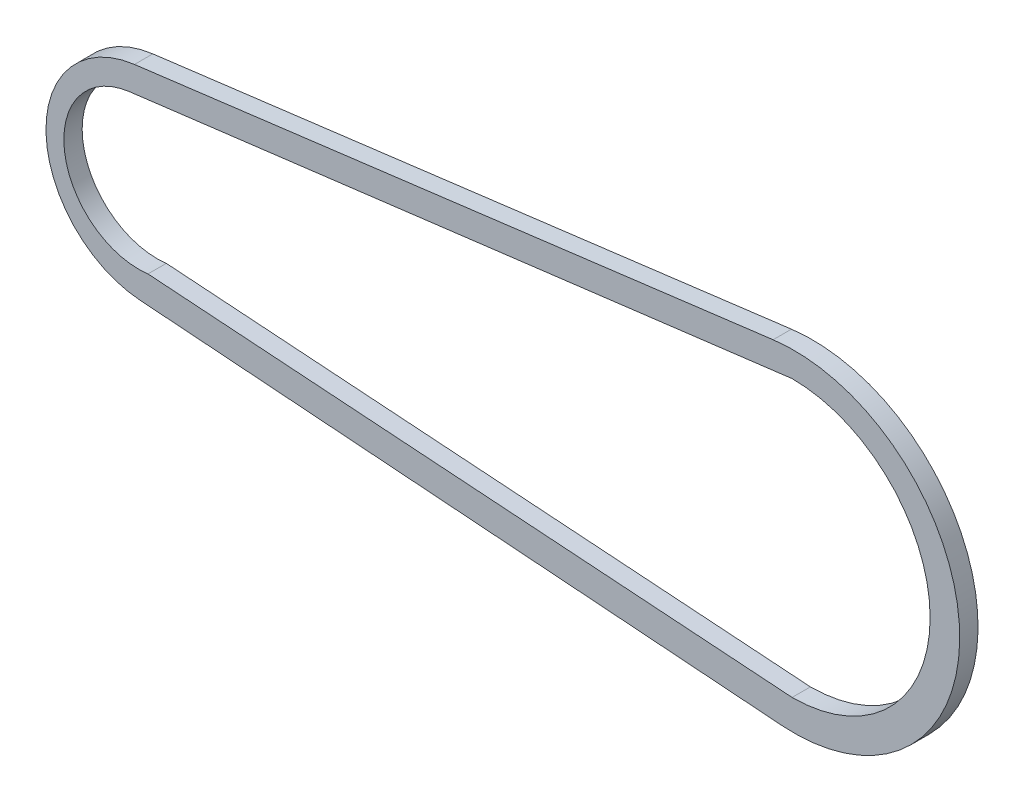
ISO-10303-21;
HEADER;
FILE_DESCRIPTION(('STEP AP214'),'2;1');
FILE_NAME('part.step','',(''),(''),'','','');
FILE_SCHEMA(('AUTOMOTIVE_DESIGN { 1 0 10303 214 1 1 1 1 }'));
ENDSEC;
DATA;
#1=APPLICATION_CONTEXT('core data for automotive mechanical design processes');
#2=APPLICATION_PROTOCOL_DEFINITION('international standard','automotive_design',2000,#1);
#3=PRODUCT_CONTEXT('',#1,'mechanical');
#4=PRODUCT('Part','Part','',(#3));
#5=PRODUCT_RELATED_PRODUCT_CATEGORY('part','',(#4));
#6=PRODUCT_DEFINITION_FORMATION('','',#4);
#7=PRODUCT_DEFINITION_CONTEXT('part definition',#1,'design');
#8=PRODUCT_DEFINITION('design','',#6,#7);
#9=PRODUCT_DEFINITION_SHAPE('','',#8);
#10=(LENGTH_UNIT() NAMED_UNIT(*) SI_UNIT(.MILLI.,.METRE.));
#11=(NAMED_UNIT(*) PLANE_ANGLE_UNIT() SI_UNIT($,.RADIAN.));
#12=(NAMED_UNIT(*) SI_UNIT($,.STERADIAN.) SOLID_ANGLE_UNIT());
#13=UNCERTAINTY_MEASURE_WITH_UNIT(LENGTH_MEASURE(1.E-05),#10,'distance_accuracy_value','');
#14=(GEOMETRIC_REPRESENTATION_CONTEXT(3) GLOBAL_UNCERTAINTY_ASSIGNED_CONTEXT((#13)) GLOBAL_UNIT_ASSIGNED_CONTEXT((#10,
#11,#12)) REPRESENTATION_CONTEXT('',''));
#15=CARTESIAN_POINT('',(0.,0.,0.));
#16=DIRECTION('',(0.,0.,1.));
#17=DIRECTION('',(1.,0.,0.));
#18=AXIS2_PLACEMENT_3D('',#15,#16,#17);
#19=CARTESIAN_POINT('',(334.170150376708,26.7589443408219,0.));
#20=DIRECTION('',(0.,0.,-1.));
#21=DIRECTION('',(-1.,0.,0.));
#22=AXIS2_PLACEMENT_3D('',#19,#20,#21);
#23=CYLINDRICAL_SURFACE('',#22,90.4461105360026);
#24=DIRECTION('',(0.,0.,-1.));
#25=VECTOR('',#24,1.);
#26=CARTESIAN_POINT('',(327.508384316098,-63.4414979199814,10.));
#27=LINE('',#26,#25);
#28=CARTESIAN_POINT('',(327.508384316098,-63.4414979199814,0.));
#29=VERTEX_POINT('',#28);
#30=CARTESIAN_POINT('',(327.508384316098,-63.4414979199814,10.));
#31=VERTEX_POINT('',#30);
#32=EDGE_CURVE('E164',#29,#31,#27,.F.);
#33=ORIENTED_EDGE('',*,*,#32,.F.);
#34=CARTESIAN_POINT('',(334.170150376708,26.7589443408219,0.));
#35=DIRECTION('',(0.,0.,-1.));
#36=DIRECTION('',(-1.,0.,0.));
#37=AXIS2_PLACEMENT_3D('',#34,#35,#36);
#38=CIRCLE('',#37,90.4461105360026);
#39=CARTESIAN_POINT('',(322.802434907123,116.487835764339,0.));
#40=VERTEX_POINT('',#39);
#41=EDGE_CURVE('E51',#40,#29,#38,.T.);
#42=ORIENTED_EDGE('',*,*,#41,.F.);
#43=DIRECTION('',(0.,0.,-1.));
#44=VECTOR('',#43,1.);
#45=CARTESIAN_POINT('',(322.802434907122,116.487835764339,10.));
#46=LINE('',#45,#44);
#47=CARTESIAN_POINT('',(322.802434907123,116.487835764339,10.));
#48=VERTEX_POINT('',#47);
#49=EDGE_CURVE('E167',#48,#40,#46,.T.);
#50=ORIENTED_EDGE('',*,*,#49,.F.);
#51=CARTESIAN_POINT('',(334.170150376708,26.7589443408219,10.));
#52=DIRECTION('',(0.,0.,-1.));
#53=DIRECTION('',(-1.,0.,0.));
#54=AXIS2_PLACEMENT_3D('',#51,#52,#53);
#55=CIRCLE('',#54,90.4461105360026);
#56=EDGE_CURVE('E12',#31,#48,#55,.F.);
#57=ORIENTED_EDGE('',*,*,#56,.F.);
#58=EDGE_LOOP('',(#33,#42,#50,#57));
#59=FACE_BOUND('',#58,.T.);
#60=ADVANCED_FACE('F43',(#59),#23,.T.);
#61=CARTESIAN_POINT('',(-18.7822793276164,17.5276742418741,0.));
#62=DIRECTION('',(0.,0.,-1.));
#63=DIRECTION('',(-1.,0.,0.));
#64=AXIS2_PLACEMENT_3D('',#61,#62,#63);
#65=CYLINDRICAL_SURFACE('',#64,55.2433677768149);
#66=DIRECTION('',(0.,0.,-1.));
#67=VECTOR('',#66,1.);
#68=CARTESIAN_POINT('',(-25.7255396043369,72.3329734387049,10.));
#69=LINE('',#68,#67);
#70=CARTESIAN_POINT('',(-25.7255396043369,72.3329734387049,0.));
#71=VERTEX_POINT('',#70);
#72=CARTESIAN_POINT('',(-25.7255396043369,72.3329734387049,10.));
#73=VERTEX_POINT('',#72);
#74=EDGE_CURVE('E150',#71,#73,#69,.F.);
#75=ORIENTED_EDGE('',*,*,#74,.F.);
#76=CARTESIAN_POINT('',(-18.7822793276164,17.5276742418741,0.));
#77=DIRECTION('',(0.,0.,-1.));
#78=DIRECTION('',(-1.,0.,0.));
#79=AXIS2_PLACEMENT_3D('',#76,#77,#78);
#80=CIRCLE('',#79,55.2433677768149);
#81=CARTESIAN_POINT('',(-22.851203799309,-37.5656423851733,0.));
#82=VERTEX_POINT('',#81);
#83=EDGE_CURVE('E159',#82,#71,#80,.T.);
#84=ORIENTED_EDGE('',*,*,#83,.F.);
#85=DIRECTION('',(0.,0.,-1.));
#86=VECTOR('',#85,1.);
#87=CARTESIAN_POINT('',(-22.851203799309,-37.5656423851733,10.));
#88=LINE('',#87,#86);
#89=CARTESIAN_POINT('',(-22.851203799309,-37.5656423851733,10.));
#90=VERTEX_POINT('',#89);
#91=EDGE_CURVE('E156',#90,#82,#88,.T.);
#92=ORIENTED_EDGE('',*,*,#91,.F.);
#93=CARTESIAN_POINT('',(-18.7822793276164,17.5276742418741,10.));
#94=DIRECTION('',(0.,0.,-1.));
#95=DIRECTION('',(-1.,0.,0.));
#96=AXIS2_PLACEMENT_3D('',#93,#94,#95);
#97=CIRCLE('',#96,55.2433677768149);
#98=EDGE_CURVE('E162',#73,#90,#97,.F.);
#99=ORIENTED_EDGE('',*,*,#98,.F.);
#100=EDGE_LOOP('',(#75,#84,#92,#99));
#101=FACE_BOUND('',#100,.T.);
#102=ADVANCED_FACE('F181',(#101),#65,.T.);
#103=CARTESIAN_POINT('',(-74.0256471044313,66.213853158706,10.));
#104=DIRECTION('',(0.125684956514083,-0.992070205028885,0.));
#105=DIRECTION('',(0.992070205028885,0.125684956514083,0.));
#106=AXIS2_PLACEMENT_3D('',#103,#104,#105);
#107=PLANE('',#106);
#108=DIRECTION('',(-0.992070205028885,-0.125684956514083,0.));
#109=VECTOR('',#108,1.);
#110=CARTESIAN_POINT('',(-74.0256471044313,66.213853158706,10.));
#111=LINE('',#110,#109);
#112=EDGE_CURVE('E144',#48,#73,#111,.T.);
#113=ORIENTED_EDGE('',*,*,#112,.F.);
#114=ORIENTED_EDGE('',*,*,#49,.T.);
#115=DIRECTION('',(-0.992070205028885,-0.125684956514083,0.));
#116=VECTOR('',#115,1.);
#117=CARTESIAN_POINT('',(-74.0256471044313,66.213853158706,0.));
#118=LINE('',#117,#116);
#119=EDGE_CURVE('E140',#40,#71,#118,.T.);
#120=ORIENTED_EDGE('',*,*,#119,.T.);
#121=ORIENTED_EDGE('',*,*,#74,.T.);
#122=EDGE_LOOP('',(#113,#114,#120,#121));
#123=FACE_BOUND('',#122,.T.);
#124=ADVANCED_FACE('F184',(#123),#107,.F.);
#125=CARTESIAN_POINT('',(424.616260912711,-70.613413492842,10.));
#126=DIRECTION('',(0.073654533303096,0.997283816034284,0.));
#127=DIRECTION('',(-0.997283816034284,0.073654533303096,0.));
#128=AXIS2_PLACEMENT_3D('',#125,#126,#127);
#129=PLANE('',#128);
#130=DIRECTION('',(0.997283816034284,-0.073654533303096,0.));
#131=VECTOR('',#130,1.);
#132=CARTESIAN_POINT('',(424.616260912711,-70.613413492842,0.));
#133=LINE('',#132,#131);
#134=EDGE_CURVE('E147',#82,#29,#133,.T.);
#135=ORIENTED_EDGE('',*,*,#134,.T.);
#136=ORIENTED_EDGE('',*,*,#32,.T.);
#137=DIRECTION('',(0.997283816034284,-0.073654533303096,0.));
#138=VECTOR('',#137,1.);
#139=CARTESIAN_POINT('',(424.616260912711,-70.613413492842,10.));
#140=LINE('',#139,#138);
#141=EDGE_CURVE('E146',#90,#31,#140,.T.);
#142=ORIENTED_EDGE('',*,*,#141,.F.);
#143=ORIENTED_EDGE('',*,*,#91,.T.);
#144=EDGE_LOOP('',(#135,#136,#142,#143));
#145=FACE_BOUND('',#144,.T.);
#146=ADVANCED_FACE('F176',(#145),#129,.F.);
#147=CARTESIAN_POINT('',(0.,0.,10.));
#148=DIRECTION('',(0.,0.,-1.));
#149=DIRECTION('',(-1.,0.,0.));
#150=AXIS2_PLACEMENT_3D('',#147,#148,#149);
#151=PLANE('',#150);
#152=DIRECTION('',(0.997597962243883,-0.0692698038603488,0.));
#153=VECTOR('',#152,1.);
#154=CARTESIAN_POINT('',(-18.3537439433149,-22.9837509239603,10.));
#155=LINE('',#154,#153);
#156=CARTESIAN_POINT('',(-18.3537439433149,-22.9837509239603,10.));
#157=VERTEX_POINT('',#156);
#158=CARTESIAN_POINT('',(333.136967432265,-47.3900684558807,10.));
#159=VERTEX_POINT('',#158);
#160=EDGE_CURVE('E134',#157,#159,#155,.T.);
#161=ORIENTED_EDGE('',*,*,#160,.F.);
#162=CARTESIAN_POINT('',(-23.4204557240256,17.5499433217256,10.));
#163=DIRECTION('',(0.,0.,1.));
#164=DIRECTION('',(1.,0.,0.));
#165=AXIS2_PLACEMENT_3D('',#162,#163,#164);
#166=CIRCLE('',#165,40.8491363124307);
#167=CARTESIAN_POINT('',(-28.4871675047363,58.0836375674115,10.));
#168=VERTEX_POINT('',#167);
#169=EDGE_CURVE('E58',#168,#157,#166,.T.);
#170=ORIENTED_EDGE('',*,*,#169,.F.);
#171=DIRECTION('',(-0.992277876713668,-0.124034734589209,0.));
#172=VECTOR('',#171,1.);
#173=CARTESIAN_POINT('',(-28.4871675047363,58.0836375674115,10.));
#174=LINE('',#173,#172);
#175=CARTESIAN_POINT('',(333.136967432265,103.286654434537,10.));
#176=VERTEX_POINT('',#175);
#177=EDGE_CURVE('E125',#176,#168,#174,.T.);
#178=ORIENTED_EDGE('',*,*,#177,.F.);
#179=CARTESIAN_POINT('',(333.136967432265,27.948292989328,10.));
#180=DIRECTION('',(0.,0.,1.));
#181=DIRECTION('',(-1.,0.,0.));
#182=AXIS2_PLACEMENT_3D('',#179,#180,#181);
#183=CIRCLE('',#182,75.3383614452087);
#184=EDGE_CURVE('E128',#159,#176,#183,.T.);
#185=ORIENTED_EDGE('',*,*,#184,.F.);
#186=EDGE_LOOP('',(#161,#170,#178,#185));
#187=FACE_BOUND('',#186,.T.);
#188=ORIENTED_EDGE('',*,*,#141,.T.);
#189=ORIENTED_EDGE('',*,*,#56,.T.);
#190=ORIENTED_EDGE('',*,*,#112,.T.);
#191=ORIENTED_EDGE('',*,*,#98,.T.);
#192=EDGE_LOOP('',(#188,#189,#190,#191));
#193=FACE_BOUND('',#192,.T.);
#194=ADVANCED_FACE('F186',(#187,#193),#151,.F.);
#195=CARTESIAN_POINT('',(0.,0.,0.));
#196=DIRECTION('',(0.,0.,-1.));
#197=DIRECTION('',(-1.,0.,0.));
#198=AXIS2_PLACEMENT_3D('',#195,#196,#197);
#199=PLANE('',#198);
#200=CARTESIAN_POINT('',(-23.4204557240256,17.5499433217256,0.));
#201=DIRECTION('',(0.,0.,1.));
#202=DIRECTION('',(1.,0.,0.));
#203=AXIS2_PLACEMENT_3D('',#200,#201,#202);
#204=CIRCLE('',#203,40.8491363124307);
#205=CARTESIAN_POINT('',(-28.4871675047363,58.0836375674115,0.));
#206=VERTEX_POINT('',#205);
#207=CARTESIAN_POINT('',(-18.3537439433149,-22.9837509239603,0.));
#208=VERTEX_POINT('',#207);
#209=EDGE_CURVE('E109',#206,#208,#204,.T.);
#210=ORIENTED_EDGE('',*,*,#209,.T.);
#211=DIRECTION('',(0.997597962243883,-0.0692698038603488,0.));
#212=VECTOR('',#211,1.);
#213=CARTESIAN_POINT('',(-18.3537439433149,-22.9837509239603,0.));
#214=LINE('',#213,#212);
#215=CARTESIAN_POINT('',(333.136967432265,-47.3900684558807,0.));
#216=VERTEX_POINT('',#215);
#217=EDGE_CURVE('E118',#208,#216,#214,.T.);
#218=ORIENTED_EDGE('',*,*,#217,.T.);
#219=CARTESIAN_POINT('',(333.136967432265,27.948292989328,0.));
#220=DIRECTION('',(0.,0.,1.));
#221=DIRECTION('',(-1.,0.,0.));
#222=AXIS2_PLACEMENT_3D('',#219,#220,#221);
#223=CIRCLE('',#222,75.3383614452087);
#224=CARTESIAN_POINT('',(333.136967432265,103.286654434537,0.));
#225=VERTEX_POINT('',#224);
#226=EDGE_CURVE('E66',#216,#225,#223,.T.);
#227=ORIENTED_EDGE('',*,*,#226,.T.);
#228=DIRECTION('',(-0.992277876713668,-0.124034734589209,0.));
#229=VECTOR('',#228,1.);
#230=CARTESIAN_POINT('',(-28.4871675047363,58.0836375674115,0.));
#231=LINE('',#230,#229);
#232=EDGE_CURVE('E115',#225,#206,#231,.T.);
#233=ORIENTED_EDGE('',*,*,#232,.T.);
#234=EDGE_LOOP('',(#210,#218,#227,#233));
#235=FACE_BOUND('',#234,.T.);
#236=ORIENTED_EDGE('',*,*,#119,.F.);
#237=ORIENTED_EDGE('',*,*,#41,.T.);
#238=ORIENTED_EDGE('',*,*,#134,.F.);
#239=ORIENTED_EDGE('',*,*,#83,.T.);
#240=EDGE_LOOP('',(#236,#237,#238,#239));
#241=FACE_BOUND('',#240,.T.);
#242=ADVANCED_FACE('F122',(#235,#241),#199,.T.);
#243=CARTESIAN_POINT('',(-23.4204557240256,17.5499433217256,0.));
#244=DIRECTION('',(0.,0.,1.));
#245=DIRECTION('',(1.,0.,0.));
#246=AXIS2_PLACEMENT_3D('',#243,#244,#245);
#247=CYLINDRICAL_SURFACE('',#246,40.8491363124307);
#248=ORIENTED_EDGE('',*,*,#169,.T.);
#249=DIRECTION('',(0.,0.,1.));
#250=VECTOR('',#249,1.);
#251=CARTESIAN_POINT('',(-18.3537439433149,-22.9837509239603,0.));
#252=LINE('',#251,#250);
#253=EDGE_CURVE('E105',#208,#157,#252,.T.);
#254=ORIENTED_EDGE('',*,*,#253,.F.);
#255=ORIENTED_EDGE('',*,*,#209,.F.);
#256=DIRECTION('',(0.,0.,1.));
#257=VECTOR('',#256,1.);
#258=CARTESIAN_POINT('',(-28.4871675047363,58.0836375674115,0.));
#259=LINE('',#258,#257);
#260=EDGE_CURVE('E138',#206,#168,#259,.T.);
#261=ORIENTED_EDGE('',*,*,#260,.T.);
#262=EDGE_LOOP('',(#248,#254,#255,#261));
#263=FACE_BOUND('',#262,.T.);
#264=ADVANCED_FACE('F107',(#263),#247,.F.);
#265=CARTESIAN_POINT('',(-28.4871675047363,58.0836375674115,0.));
#266=DIRECTION('',(-0.124034734589209,0.992277876713668,0.));
#267=DIRECTION('',(-0.992277876713668,-0.124034734589209,0.));
#268=AXIS2_PLACEMENT_3D('',#265,#266,#267);
#269=PLANE('',#268);
#270=ORIENTED_EDGE('',*,*,#177,.T.);
#271=ORIENTED_EDGE('',*,*,#260,.F.);
#272=ORIENTED_EDGE('',*,*,#232,.F.);
#273=DIRECTION('',(0.,0.,1.));
#274=VECTOR('',#273,1.);
#275=CARTESIAN_POINT('',(333.136967432265,103.286654434537,0.));
#276=LINE('',#275,#274);
#277=EDGE_CURVE('E141',#225,#176,#276,.T.);
#278=ORIENTED_EDGE('',*,*,#277,.T.);
#279=EDGE_LOOP('',(#270,#271,#272,#278));
#280=FACE_BOUND('',#279,.T.);
#281=ADVANCED_FACE('F236',(#280),#269,.F.);
#282=CARTESIAN_POINT('',(333.136967432265,27.948292989328,0.));
#283=DIRECTION('',(0.,0.,1.));
#284=DIRECTION('',(1.,0.,0.));
#285=AXIS2_PLACEMENT_3D('',#282,#283,#284);
#286=CYLINDRICAL_SURFACE('',#285,75.3383614452087);
#287=ORIENTED_EDGE('',*,*,#184,.T.);
#288=ORIENTED_EDGE('',*,*,#277,.F.);
#289=ORIENTED_EDGE('',*,*,#226,.F.);
#290=DIRECTION('',(0.,0.,1.));
#291=VECTOR('',#290,1.);
#292=CARTESIAN_POINT('',(333.136967432265,-47.3900684558807,0.));
#293=LINE('',#292,#291);
#294=EDGE_CURVE('E114',#216,#159,#293,.T.);
#295=ORIENTED_EDGE('',*,*,#294,.T.);
#296=EDGE_LOOP('',(#287,#288,#289,#295));
#297=FACE_BOUND('',#296,.T.);
#298=ADVANCED_FACE('F245',(#297),#286,.F.);
#299=CARTESIAN_POINT('',(-18.3537439433149,-22.9837509239603,0.));
#300=DIRECTION('',(-0.0692698038603488,-0.997597962243883,0.));
#301=DIRECTION('',(0.997597962243884,-0.0692698038603488,0.));
#302=AXIS2_PLACEMENT_3D('',#299,#300,#301);
#303=PLANE('',#302);
#304=ORIENTED_EDGE('',*,*,#160,.T.);
#305=ORIENTED_EDGE('',*,*,#294,.F.);
#306=ORIENTED_EDGE('',*,*,#217,.F.);
#307=ORIENTED_EDGE('',*,*,#253,.T.);
#308=EDGE_LOOP('',(#304,#305,#306,#307));
#309=FACE_BOUND('',#308,.T.);
#310=ADVANCED_FACE('F119',(#309),#303,.F.);
#311=CLOSED_SHELL('',(#60,#102,#124,#146,#194,#242,#264,#281,#298,#310));
#312=MANIFOLD_SOLID_BREP('B2',#311);
#313=ADVANCED_BREP_SHAPE_REPRESENTATION('',(#18,#312),#14);
#314=SHAPE_DEFINITION_REPRESENTATION(#9,#313);
ENDSEC;
END-ISO-10303-21;
